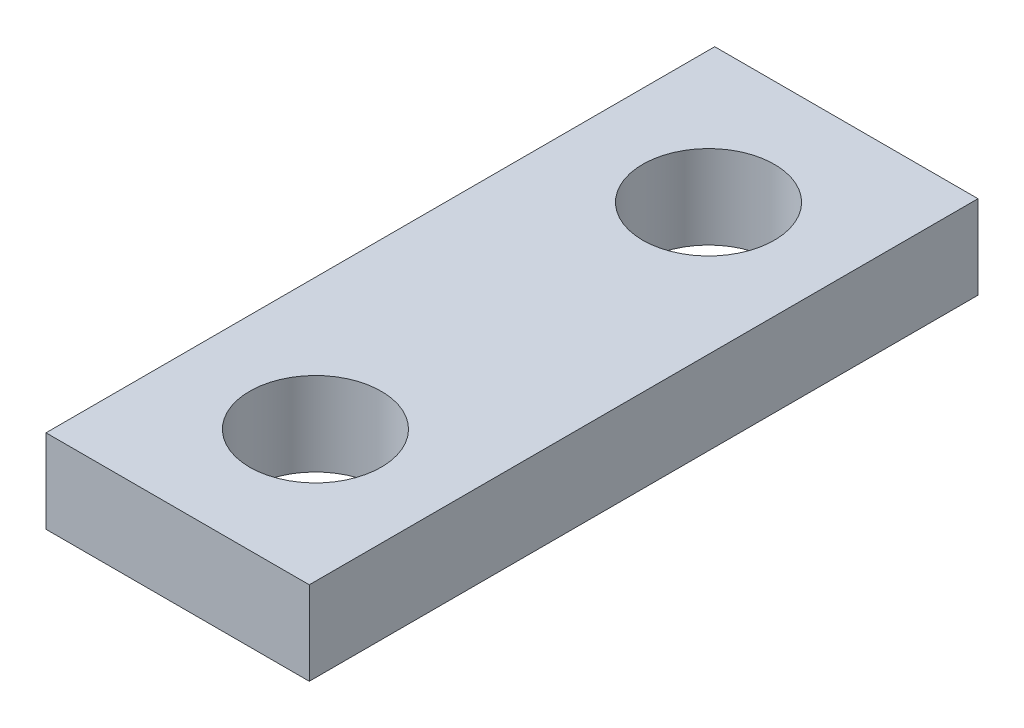
ISO-10303-21;
HEADER;
FILE_DESCRIPTION(('STEP AP214'),'2;1');
FILE_NAME('part.step','',(''),(''),'','','');
FILE_SCHEMA(('AUTOMOTIVE_DESIGN { 1 0 10303 214 1 1 1 1 }'));
ENDSEC;
DATA;
#1=APPLICATION_CONTEXT('core data for automotive mechanical design processes');
#2=APPLICATION_PROTOCOL_DEFINITION('international standard','automotive_design',2000,#1);
#3=PRODUCT_CONTEXT('',#1,'mechanical');
#4=PRODUCT('Part','Part','',(#3));
#5=PRODUCT_RELATED_PRODUCT_CATEGORY('part','',(#4));
#6=PRODUCT_DEFINITION_FORMATION('','',#4);
#7=PRODUCT_DEFINITION_CONTEXT('part definition',#1,'design');
#8=PRODUCT_DEFINITION('design','',#6,#7);
#9=PRODUCT_DEFINITION_SHAPE('','',#8);
#10=(LENGTH_UNIT() NAMED_UNIT(*) SI_UNIT(.MILLI.,.METRE.));
#11=(NAMED_UNIT(*) PLANE_ANGLE_UNIT() SI_UNIT($,.RADIAN.));
#12=(NAMED_UNIT(*) SI_UNIT($,.STERADIAN.) SOLID_ANGLE_UNIT());
#13=UNCERTAINTY_MEASURE_WITH_UNIT(LENGTH_MEASURE(1.E-05),#10,'distance_accuracy_value','');
#14=(GEOMETRIC_REPRESENTATION_CONTEXT(3) GLOBAL_UNCERTAINTY_ASSIGNED_CONTEXT((#13)) GLOBAL_UNIT_ASSIGNED_CONTEXT((#10,
#11,#12)) REPRESENTATION_CONTEXT('',''));
#15=CARTESIAN_POINT('',(0.,0.,0.));
#16=DIRECTION('',(0.,0.,1.));
#17=DIRECTION('',(1.,0.,0.));
#18=AXIS2_PLACEMENT_3D('',#15,#16,#17);
#19=CARTESIAN_POINT('',(5.,1.5875,12.7));
#20=DIRECTION('',(-1.,0.,0.));
#21=DIRECTION('',(0.,0.,1.));
#22=AXIS2_PLACEMENT_3D('',#19,#20,#21);
#23=PLANE('',#22);
#24=DIRECTION('',(0.,0.,-1.));
#25=VECTOR('',#24,1.);
#26=CARTESIAN_POINT('',(5.,-1.5875,12.7));
#27=LINE('',#26,#25);
#28=CARTESIAN_POINT('',(5.,-1.5875,12.7));
#29=VERTEX_POINT('',#28);
#30=CARTESIAN_POINT('',(5.,-1.5875,-12.7));
#31=VERTEX_POINT('',#30);
#32=EDGE_CURVE('E96',#29,#31,#27,.T.);
#33=ORIENTED_EDGE('',*,*,#32,.T.);
#34=DIRECTION('',(0.,-1.,0.));
#35=VECTOR('',#34,1.);
#36=CARTESIAN_POINT('',(5.,1.5875,-12.7));
#37=LINE('',#36,#35);
#38=CARTESIAN_POINT('',(5.,1.5875,-12.7));
#39=VERTEX_POINT('',#38);
#40=EDGE_CURVE('E11',#39,#31,#37,.T.);
#41=ORIENTED_EDGE('',*,*,#40,.F.);
#42=DIRECTION('',(0.,0.,-1.));
#43=VECTOR('',#42,1.);
#44=CARTESIAN_POINT('',(5.,1.5875,12.7));
#45=LINE('',#44,#43);
#46=CARTESIAN_POINT('',(5.,1.5875,12.7));
#47=VERTEX_POINT('',#46);
#48=EDGE_CURVE('E84',#47,#39,#45,.T.);
#49=ORIENTED_EDGE('',*,*,#48,.F.);
#50=DIRECTION('',(0.,-1.,0.));
#51=VECTOR('',#50,1.);
#52=CARTESIAN_POINT('',(5.,1.5875,12.7));
#53=LINE('',#52,#51);
#54=EDGE_CURVE('E92',#47,#29,#53,.T.);
#55=ORIENTED_EDGE('',*,*,#54,.T.);
#56=EDGE_LOOP('',(#33,#41,#49,#55));
#57=FACE_BOUND('',#56,.T.);
#58=ADVANCED_FACE('F33',(#57),#23,.F.);
#59=CARTESIAN_POINT('',(-5.,1.5875,-12.7));
#60=DIRECTION('',(0.,0.,1.));
#61=DIRECTION('',(1.,0.,0.));
#62=AXIS2_PLACEMENT_3D('',#59,#60,#61);
#63=PLANE('',#62);
#64=DIRECTION('',(-1.,0.,0.));
#65=VECTOR('',#64,1.);
#66=CARTESIAN_POINT('',(-5.,-1.5875,-12.7));
#67=LINE('',#66,#65);
#68=CARTESIAN_POINT('',(-5.,-1.5875,-12.7));
#69=VERTEX_POINT('',#68);
#70=EDGE_CURVE('E88',#31,#69,#67,.T.);
#71=ORIENTED_EDGE('',*,*,#70,.T.);
#72=DIRECTION('',(0.,-1.,0.));
#73=VECTOR('',#72,1.);
#74=CARTESIAN_POINT('',(-5.,1.5875,-12.7));
#75=LINE('',#74,#73);
#76=CARTESIAN_POINT('',(-5.,1.5875,-12.7));
#77=VERTEX_POINT('',#76);
#78=EDGE_CURVE('E41',#77,#69,#75,.T.);
#79=ORIENTED_EDGE('',*,*,#78,.F.);
#80=DIRECTION('',(-1.,0.,0.));
#81=VECTOR('',#80,1.);
#82=CARTESIAN_POINT('',(-5.,1.5875,-12.7));
#83=LINE('',#82,#81);
#84=EDGE_CURVE('E79',#39,#77,#83,.T.);
#85=ORIENTED_EDGE('',*,*,#84,.F.);
#86=ORIENTED_EDGE('',*,*,#40,.T.);
#87=EDGE_LOOP('',(#71,#79,#85,#86));
#88=FACE_BOUND('',#87,.T.);
#89=ADVANCED_FACE('F87',(#88),#63,.F.);
#90=CARTESIAN_POINT('',(-5.,1.5875,12.7));
#91=DIRECTION('',(1.,0.,0.));
#92=DIRECTION('',(0.,0.,-1.));
#93=AXIS2_PLACEMENT_3D('',#90,#91,#92);
#94=PLANE('',#93);
#95=DIRECTION('',(0.,0.,1.));
#96=VECTOR('',#95,1.);
#97=CARTESIAN_POINT('',(-5.,-1.5875,12.7));
#98=LINE('',#97,#96);
#99=CARTESIAN_POINT('',(-5.,-1.5875,12.7));
#100=VERTEX_POINT('',#99);
#101=EDGE_CURVE('E66',#69,#100,#98,.T.);
#102=ORIENTED_EDGE('',*,*,#101,.T.);
#103=DIRECTION('',(0.,-1.,0.));
#104=VECTOR('',#103,1.);
#105=CARTESIAN_POINT('',(-5.,1.5875,12.7));
#106=LINE('',#105,#104);
#107=CARTESIAN_POINT('',(-5.,1.5875,12.7));
#108=VERTEX_POINT('',#107);
#109=EDGE_CURVE('E89',#108,#100,#106,.T.);
#110=ORIENTED_EDGE('',*,*,#109,.F.);
#111=DIRECTION('',(0.,0.,1.));
#112=VECTOR('',#111,1.);
#113=CARTESIAN_POINT('',(-5.,1.5875,12.7));
#114=LINE('',#113,#112);
#115=EDGE_CURVE('E82',#77,#108,#114,.T.);
#116=ORIENTED_EDGE('',*,*,#115,.F.);
#117=ORIENTED_EDGE('',*,*,#78,.T.);
#118=EDGE_LOOP('',(#102,#110,#116,#117));
#119=FACE_BOUND('',#118,.T.);
#120=ADVANCED_FACE('F90',(#119),#94,.F.);
#121=CARTESIAN_POINT('',(-5.,1.5875,12.7));
#122=DIRECTION('',(0.,0.,-1.));
#123=DIRECTION('',(-1.,0.,0.));
#124=AXIS2_PLACEMENT_3D('',#121,#122,#123);
#125=PLANE('',#124);
#126=DIRECTION('',(1.,0.,0.));
#127=VECTOR('',#126,1.);
#128=CARTESIAN_POINT('',(-5.,-1.5875,12.7));
#129=LINE('',#128,#127);
#130=EDGE_CURVE('E72',#100,#29,#129,.T.);
#131=ORIENTED_EDGE('',*,*,#130,.T.);
#132=ORIENTED_EDGE('',*,*,#54,.F.);
#133=DIRECTION('',(1.,0.,0.));
#134=VECTOR('',#133,1.);
#135=CARTESIAN_POINT('',(-5.,1.5875,12.7));
#136=LINE('',#135,#134);
#137=EDGE_CURVE('E49',#108,#47,#136,.T.);
#138=ORIENTED_EDGE('',*,*,#137,.F.);
#139=ORIENTED_EDGE('',*,*,#109,.T.);
#140=EDGE_LOOP('',(#131,#132,#138,#139));
#141=FACE_BOUND('',#140,.T.);
#142=ADVANCED_FACE('F104',(#141),#125,.F.);
#143=CARTESIAN_POINT('',(0.,1.5875,0.));
#144=DIRECTION('',(0.,-1.,0.));
#145=DIRECTION('',(0.,0.,-1.));
#146=AXIS2_PLACEMENT_3D('',#143,#144,#145);
#147=PLANE('',#146);
#148=CARTESIAN_POINT('',(0.,1.5875,-7.465));
#149=DIRECTION('',(0.,1.,0.));
#150=DIRECTION('',(0.,0.,1.));
#151=AXIS2_PLACEMENT_3D('',#148,#149,#150);
#152=CIRCLE('',#151,2.5);
#153=CARTESIAN_POINT('',(0.,1.5875,-4.965));
#154=VERTEX_POINT('',#153);
#155=EDGE_CURVE('E116',#154,#154,#152,.T.);
#156=ORIENTED_EDGE('',*,*,#155,.F.);
#157=EDGE_LOOP('',(#156));
#158=FACE_BOUND('',#157,.T.);
#159=CARTESIAN_POINT('',(0.,1.5875,7.465));
#160=DIRECTION('',(0.,1.,0.));
#161=DIRECTION('',(0.,0.,1.));
#162=AXIS2_PLACEMENT_3D('',#159,#160,#161);
#163=CIRCLE('',#162,2.5);
#164=CARTESIAN_POINT('',(0.,1.5875,9.965));
#165=VERTEX_POINT('',#164);
#166=EDGE_CURVE('E110',#165,#165,#163,.T.);
#167=ORIENTED_EDGE('',*,*,#166,.F.);
#168=EDGE_LOOP('',(#167));
#169=FACE_BOUND('',#168,.T.);
#170=ORIENTED_EDGE('',*,*,#48,.T.);
#171=ORIENTED_EDGE('',*,*,#84,.T.);
#172=ORIENTED_EDGE('',*,*,#115,.T.);
#173=ORIENTED_EDGE('',*,*,#137,.T.);
#174=EDGE_LOOP('',(#170,#171,#172,#173));
#175=FACE_BOUND('',#174,.T.);
#176=ADVANCED_FACE('F80',(#158,#169,#175),#147,.F.);
#177=CARTESIAN_POINT('',(0.,-1.5875,0.));
#178=DIRECTION('',(0.,-1.,0.));
#179=DIRECTION('',(0.,0.,-1.));
#180=AXIS2_PLACEMENT_3D('',#177,#178,#179);
#181=PLANE('',#180);
#182=CARTESIAN_POINT('',(0.,-1.5875,-7.465));
#183=DIRECTION('',(0.,1.,0.));
#184=DIRECTION('',(0.,0.,1.));
#185=AXIS2_PLACEMENT_3D('',#182,#183,#184);
#186=CIRCLE('',#185,2.5);
#187=CARTESIAN_POINT('',(0.,-1.5875,-4.965));
#188=VERTEX_POINT('',#187);
#189=EDGE_CURVE('E99',#188,#188,#186,.T.);
#190=ORIENTED_EDGE('',*,*,#189,.T.);
#191=EDGE_LOOP('',(#190));
#192=FACE_BOUND('',#191,.T.);
#193=CARTESIAN_POINT('',(0.,-1.5875,7.465));
#194=DIRECTION('',(0.,1.,0.));
#195=DIRECTION('',(0.,0.,1.));
#196=AXIS2_PLACEMENT_3D('',#193,#194,#195);
#197=CIRCLE('',#196,2.5);
#198=CARTESIAN_POINT('',(0.,-1.5875,9.965));
#199=VERTEX_POINT('',#198);
#200=EDGE_CURVE('E113',#199,#199,#197,.T.);
#201=ORIENTED_EDGE('',*,*,#200,.T.);
#202=EDGE_LOOP('',(#201));
#203=FACE_BOUND('',#202,.T.);
#204=ORIENTED_EDGE('',*,*,#32,.F.);
#205=ORIENTED_EDGE('',*,*,#130,.F.);
#206=ORIENTED_EDGE('',*,*,#101,.F.);
#207=ORIENTED_EDGE('',*,*,#70,.F.);
#208=EDGE_LOOP('',(#204,#205,#206,#207));
#209=FACE_BOUND('',#208,.T.);
#210=ADVANCED_FACE('F107',(#192,#203,#209),#181,.T.);
#211=CARTESIAN_POINT('',(0.,-1.5875,7.465));
#212=DIRECTION('',(0.,1.,0.));
#213=DIRECTION('',(0.,0.,1.));
#214=AXIS2_PLACEMENT_3D('',#211,#212,#213);
#215=CYLINDRICAL_SURFACE('',#214,2.5);
#216=ORIENTED_EDGE('',*,*,#200,.F.);
#217=EDGE_LOOP('',(#216));
#218=FACE_BOUND('',#217,.T.);
#219=ORIENTED_EDGE('',*,*,#166,.T.);
#220=EDGE_LOOP('',(#219));
#221=FACE_BOUND('',#220,.T.);
#222=ADVANCED_FACE('F127',(#218,#221),#215,.F.);
#223=CARTESIAN_POINT('',(0.,-1.5875,-7.465));
#224=DIRECTION('',(0.,1.,0.));
#225=DIRECTION('',(0.,0.,1.));
#226=AXIS2_PLACEMENT_3D('',#223,#224,#225);
#227=CYLINDRICAL_SURFACE('',#226,2.5);
#228=ORIENTED_EDGE('',*,*,#189,.F.);
#229=EDGE_LOOP('',(#228));
#230=FACE_BOUND('',#229,.T.);
#231=ORIENTED_EDGE('',*,*,#155,.T.);
#232=EDGE_LOOP('',(#231));
#233=FACE_BOUND('',#232,.T.);
#234=ADVANCED_FACE('F124',(#230,#233),#227,.F.);
#235=CLOSED_SHELL('',(#58,#89,#120,#142,#176,#210,#222,#234));
#236=MANIFOLD_SOLID_BREP('B2',#235);
#237=ADVANCED_BREP_SHAPE_REPRESENTATION('',(#18,#236),#14);
#238=SHAPE_DEFINITION_REPRESENTATION(#9,#237);
ENDSEC;
END-ISO-10303-21;
